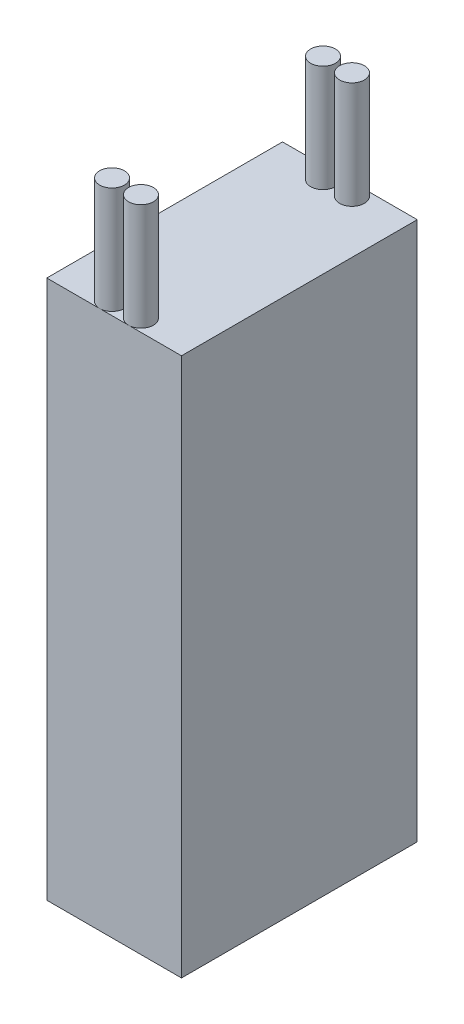
ISO-10303-21;
HEADER;
FILE_DESCRIPTION(('STEP AP214'),'2;1');
FILE_NAME('part.step','',(''),(''),'','','');
FILE_SCHEMA(('AUTOMOTIVE_DESIGN { 1 0 10303 214 1 1 1 1 }'));
ENDSEC;
DATA;
#1=APPLICATION_CONTEXT('core data for automotive mechanical design processes');
#2=APPLICATION_PROTOCOL_DEFINITION('international standard','automotive_design',2000,#1);
#3=PRODUCT_CONTEXT('',#1,'mechanical');
#4=PRODUCT('Part','Part','',(#3));
#5=PRODUCT_RELATED_PRODUCT_CATEGORY('part','',(#4));
#6=PRODUCT_DEFINITION_FORMATION('','',#4);
#7=PRODUCT_DEFINITION_CONTEXT('part definition',#1,'design');
#8=PRODUCT_DEFINITION('design','',#6,#7);
#9=PRODUCT_DEFINITION_SHAPE('','',#8);
#10=(LENGTH_UNIT() NAMED_UNIT(*) SI_UNIT(.MILLI.,.METRE.));
#11=(NAMED_UNIT(*) PLANE_ANGLE_UNIT() SI_UNIT($,.RADIAN.));
#12=(NAMED_UNIT(*) SI_UNIT($,.STERADIAN.) SOLID_ANGLE_UNIT());
#13=UNCERTAINTY_MEASURE_WITH_UNIT(LENGTH_MEASURE(1.E-05),#10,'distance_accuracy_value','');
#14=(GEOMETRIC_REPRESENTATION_CONTEXT(3) GLOBAL_UNCERTAINTY_ASSIGNED_CONTEXT((#13)) GLOBAL_UNIT_ASSIGNED_CONTEXT((#10,
#11,#12)) REPRESENTATION_CONTEXT('',''));
#15=CARTESIAN_POINT('',(0.,0.,0.));
#16=DIRECTION('',(0.,0.,1.));
#17=DIRECTION('',(1.,0.,0.));
#18=AXIS2_PLACEMENT_3D('',#15,#16,#17);
#19=CARTESIAN_POINT('',(0.,64.,0.));
#20=DIRECTION('',(1.,0.,0.));
#21=DIRECTION('',(0.,0.,-1.));
#22=AXIS2_PLACEMENT_3D('',#19,#20,#21);
#23=PLANE('',#22);
#24=DIRECTION('',(0.,0.,1.));
#25=VECTOR('',#24,1.);
#26=CARTESIAN_POINT('',(0.,0.,0.));
#27=LINE('',#26,#25);
#28=CARTESIAN_POINT('',(0.,0.,-28.));
#29=VERTEX_POINT('',#28);
#30=CARTESIAN_POINT('',(0.,0.,0.));
#31=VERTEX_POINT('',#30);
#32=EDGE_CURVE('E149',#29,#31,#27,.T.);
#33=ORIENTED_EDGE('',*,*,#32,.T.);
#34=DIRECTION('',(0.,-1.,0.));
#35=VECTOR('',#34,1.);
#36=CARTESIAN_POINT('',(0.,64.,0.));
#37=LINE('',#36,#35);
#38=CARTESIAN_POINT('',(0.,64.,0.));
#39=VERTEX_POINT('',#38);
#40=EDGE_CURVE('E11',#39,#31,#37,.T.);
#41=ORIENTED_EDGE('',*,*,#40,.F.);
#42=DIRECTION('',(0.,0.,1.));
#43=VECTOR('',#42,1.);
#44=CARTESIAN_POINT('',(0.,64.,0.));
#45=LINE('',#44,#43);
#46=CARTESIAN_POINT('',(0.,64.,-28.));
#47=VERTEX_POINT('',#46);
#48=EDGE_CURVE('E148',#47,#39,#45,.T.);
#49=ORIENTED_EDGE('',*,*,#48,.F.);
#50=DIRECTION('',(0.,-1.,0.));
#51=VECTOR('',#50,1.);
#52=CARTESIAN_POINT('',(0.,64.,-28.));
#53=LINE('',#52,#51);
#54=EDGE_CURVE('E119',#47,#29,#53,.T.);
#55=ORIENTED_EDGE('',*,*,#54,.T.);
#56=EDGE_LOOP('',(#33,#41,#49,#55));
#57=FACE_BOUND('',#56,.T.);
#58=ADVANCED_FACE('F45',(#57),#23,.F.);
#59=CARTESIAN_POINT('',(0.,64.,0.));
#60=DIRECTION('',(0.,0.,-1.));
#61=DIRECTION('',(-1.,0.,0.));
#62=AXIS2_PLACEMENT_3D('',#59,#60,#61);
#63=PLANE('',#62);
#64=DIRECTION('',(1.,0.,0.));
#65=VECTOR('',#64,1.);
#66=CARTESIAN_POINT('',(0.,0.,0.));
#67=LINE('',#66,#65);
#68=CARTESIAN_POINT('',(16.,0.,0.));
#69=VERTEX_POINT('',#68);
#70=EDGE_CURVE('E144',#31,#69,#67,.T.);
#71=ORIENTED_EDGE('',*,*,#70,.T.);
#72=DIRECTION('',(0.,-1.,0.));
#73=VECTOR('',#72,1.);
#74=CARTESIAN_POINT('',(16.,64.,0.));
#75=LINE('',#74,#73);
#76=CARTESIAN_POINT('',(16.,64.,0.));
#77=VERTEX_POINT('',#76);
#78=EDGE_CURVE('E54',#77,#69,#75,.T.);
#79=ORIENTED_EDGE('',*,*,#78,.F.);
#80=DIRECTION('',(1.,0.,0.));
#81=VECTOR('',#80,1.);
#82=CARTESIAN_POINT('',(0.,64.,0.));
#83=LINE('',#82,#81);
#84=CARTESIAN_POINT('',(9.719936624,64.,0.));
#85=VERTEX_POINT('',#84);
#86=EDGE_CURVE('E167',#85,#77,#83,.T.);
#87=ORIENTED_EDGE('',*,*,#86,.F.);
#88=CARTESIAN_POINT('',(6.280063122,64.,0.));
#89=VERTEX_POINT('',#88);
#90=EDGE_CURVE('E169',#89,#85,#83,.T.);
#91=ORIENTED_EDGE('',*,*,#90,.F.);
#92=EDGE_CURVE('E94',#39,#89,#83,.T.);
#93=ORIENTED_EDGE('',*,*,#92,.F.);
#94=ORIENTED_EDGE('',*,*,#40,.T.);
#95=EDGE_LOOP('',(#71,#79,#87,#91,#93,#94));
#96=FACE_BOUND('',#95,.T.);
#97=ADVANCED_FACE('F176',(#96),#63,.F.);
#98=CARTESIAN_POINT('',(16.,64.,0.));
#99=DIRECTION('',(-1.,0.,0.));
#100=DIRECTION('',(0.,0.,1.));
#101=AXIS2_PLACEMENT_3D('',#98,#99,#100);
#102=PLANE('',#101);
#103=DIRECTION('',(0.,0.,-1.));
#104=VECTOR('',#103,1.);
#105=CARTESIAN_POINT('',(16.,0.,0.));
#106=LINE('',#105,#104);
#107=CARTESIAN_POINT('',(16.,0.,-28.));
#108=VERTEX_POINT('',#107);
#109=EDGE_CURVE('E81',#69,#108,#106,.T.);
#110=ORIENTED_EDGE('',*,*,#109,.T.);
#111=DIRECTION('',(0.,-1.,0.));
#112=VECTOR('',#111,1.);
#113=CARTESIAN_POINT('',(16.,64.,-28.));
#114=LINE('',#113,#112);
#115=CARTESIAN_POINT('',(16.,64.,-28.));
#116=VERTEX_POINT('',#115);
#117=EDGE_CURVE('E128',#116,#108,#114,.T.);
#118=ORIENTED_EDGE('',*,*,#117,.F.);
#119=DIRECTION('',(0.,0.,-1.));
#120=VECTOR('',#119,1.);
#121=CARTESIAN_POINT('',(16.,64.,0.));
#122=LINE('',#121,#120);
#123=EDGE_CURVE('E122',#77,#116,#122,.T.);
#124=ORIENTED_EDGE('',*,*,#123,.F.);
#125=ORIENTED_EDGE('',*,*,#78,.T.);
#126=EDGE_LOOP('',(#110,#118,#124,#125));
#127=FACE_BOUND('',#126,.T.);
#128=ADVANCED_FACE('F140',(#127),#102,.F.);
#129=CARTESIAN_POINT('',(0.,64.,-28.));
#130=DIRECTION('',(0.,0.,1.));
#131=DIRECTION('',(1.,0.,0.));
#132=AXIS2_PLACEMENT_3D('',#129,#130,#131);
#133=PLANE('',#132);
#134=DIRECTION('',(-1.,0.,0.));
#135=VECTOR('',#134,1.);
#136=CARTESIAN_POINT('',(0.,0.,-28.));
#137=LINE('',#136,#135);
#138=EDGE_CURVE('E87',#108,#29,#137,.T.);
#139=ORIENTED_EDGE('',*,*,#138,.T.);
#140=ORIENTED_EDGE('',*,*,#54,.F.);
#141=DIRECTION('',(-1.,0.,0.));
#142=VECTOR('',#141,1.);
#143=CARTESIAN_POINT('',(0.,64.,-28.));
#144=LINE('',#143,#142);
#145=CARTESIAN_POINT('',(6.280063122,64.,-28.));
#146=VERTEX_POINT('',#145);
#147=EDGE_CURVE('E62',#146,#47,#144,.T.);
#148=ORIENTED_EDGE('',*,*,#147,.F.);
#149=CARTESIAN_POINT('',(9.719936624,64.,-28.));
#150=VERTEX_POINT('',#149);
#151=EDGE_CURVE('E108',#150,#146,#144,.T.);
#152=ORIENTED_EDGE('',*,*,#151,.F.);
#153=EDGE_CURVE('E116',#116,#150,#144,.T.);
#154=ORIENTED_EDGE('',*,*,#153,.F.);
#155=ORIENTED_EDGE('',*,*,#117,.T.);
#156=EDGE_LOOP('',(#139,#140,#148,#152,#154,#155));
#157=FACE_BOUND('',#156,.T.);
#158=ADVANCED_FACE('F118',(#157),#133,.F.);
#159=CARTESIAN_POINT('',(0.,64.,0.));
#160=DIRECTION('',(0.,-1.,0.));
#161=DIRECTION('',(0.,0.,-1.));
#162=AXIS2_PLACEMENT_3D('',#159,#160,#161);
#163=PLANE('',#162);
#164=ORIENTED_EDGE('',*,*,#153,.T.);
#165=CARTESIAN_POINT('',(9.719936624,64.,-26.5300632764173));
#166=DIRECTION('',(0.,1.,0.));
#167=DIRECTION('',(0.,0.,1.));
#168=AXIS2_PLACEMENT_3D('',#165,#166,#167);
#169=CIRCLE('',#168,1.4699367235827);
#170=EDGE_CURVE('E113',#150,#150,#169,.T.);
#171=ORIENTED_EDGE('',*,*,#170,.F.);
#172=ORIENTED_EDGE('',*,*,#151,.T.);
#173=CARTESIAN_POINT('',(6.280063122,64.,-26.5300632764173));
#174=DIRECTION('',(0.,1.,0.));
#175=DIRECTION('',(0.,0.,1.));
#176=AXIS2_PLACEMENT_3D('',#173,#174,#175);
#177=CIRCLE('',#176,1.4699367235827);
#178=EDGE_CURVE('E111',#146,#146,#177,.T.);
#179=ORIENTED_EDGE('',*,*,#178,.F.);
#180=ORIENTED_EDGE('',*,*,#147,.T.);
#181=ORIENTED_EDGE('',*,*,#48,.T.);
#182=ORIENTED_EDGE('',*,*,#92,.T.);
#183=CARTESIAN_POINT('',(6.280063122,64.,-1.4699367235827));
#184=DIRECTION('',(0.,1.,0.));
#185=DIRECTION('',(0.,0.,-1.));
#186=AXIS2_PLACEMENT_3D('',#183,#184,#185);
#187=CIRCLE('',#186,1.4699367235827);
#188=EDGE_CURVE('E178',#89,#89,#187,.T.);
#189=ORIENTED_EDGE('',*,*,#188,.F.);
#190=ORIENTED_EDGE('',*,*,#90,.T.);
#191=CARTESIAN_POINT('',(9.719936624,64.,-1.4699367235827));
#192=DIRECTION('',(0.,1.,0.));
#193=DIRECTION('',(0.,0.,-1.));
#194=AXIS2_PLACEMENT_3D('',#191,#192,#193);
#195=CIRCLE('',#194,1.4699367235827);
#196=EDGE_CURVE('E175',#85,#85,#195,.T.);
#197=ORIENTED_EDGE('',*,*,#196,.F.);
#198=ORIENTED_EDGE('',*,*,#86,.T.);
#199=ORIENTED_EDGE('',*,*,#123,.T.);
#200=EDGE_LOOP('',(#164,#171,#172,#179,#180,#181,#182,#189,#190,#197,#198,#199));
#201=FACE_BOUND('',#200,.T.);
#202=ADVANCED_FACE('F109',(#201),#163,.F.);
#203=CARTESIAN_POINT('',(0.,0.,0.));
#204=DIRECTION('',(0.,-1.,0.));
#205=DIRECTION('',(0.,0.,-1.));
#206=AXIS2_PLACEMENT_3D('',#203,#204,#205);
#207=PLANE('',#206);
#208=ORIENTED_EDGE('',*,*,#32,.F.);
#209=ORIENTED_EDGE('',*,*,#138,.F.);
#210=ORIENTED_EDGE('',*,*,#109,.F.);
#211=ORIENTED_EDGE('',*,*,#70,.F.);
#212=EDGE_LOOP('',(#208,#209,#210,#211));
#213=FACE_BOUND('',#212,.T.);
#214=ADVANCED_FACE('F143',(#213),#207,.T.);
#215=CARTESIAN_POINT('',(6.280063122,76.7,-26.5300632764173));
#216=DIRECTION('',(0.,-1.,0.));
#217=DIRECTION('',(0.,0.,-1.));
#218=AXIS2_PLACEMENT_3D('',#215,#216,#217);
#219=CYLINDRICAL_SURFACE('',#218,1.4699367235827);
#220=CARTESIAN_POINT('',(6.280063122,76.7,-26.5300632764173));
#221=DIRECTION('',(0.,1.,0.));
#222=DIRECTION('',(0.,0.,1.));
#223=AXIS2_PLACEMENT_3D('',#220,#221,#222);
#224=CIRCLE('',#223,1.4699367235827);
#225=CARTESIAN_POINT('',(6.280063122,76.7,-25.0601265528346));
#226=VERTEX_POINT('',#225);
#227=EDGE_CURVE('E152',#226,#226,#224,.T.);
#228=ORIENTED_EDGE('',*,*,#227,.F.);
#229=EDGE_LOOP('',(#228));
#230=FACE_BOUND('',#229,.T.);
#231=ORIENTED_EDGE('',*,*,#178,.T.);
#232=EDGE_LOOP('',(#231));
#233=FACE_BOUND('',#232,.T.);
#234=ADVANCED_FACE('F209',(#230,#233),#219,.T.);
#235=CARTESIAN_POINT('',(6.280063122,76.7,-26.5300632764173));
#236=DIRECTION('',(0.,1.,0.));
#237=DIRECTION('',(0.,0.,1.));
#238=AXIS2_PLACEMENT_3D('',#235,#236,#237);
#239=PLANE('',#238);
#240=ORIENTED_EDGE('',*,*,#227,.T.);
#241=EDGE_LOOP('',(#240));
#242=FACE_BOUND('',#241,.T.);
#243=ADVANCED_FACE('F199',(#242),#239,.T.);
#244=CARTESIAN_POINT('',(9.719936624,76.7,-1.4699367235827));
#245=DIRECTION('',(0.,-1.,0.));
#246=DIRECTION('',(0.,0.,-1.));
#247=AXIS2_PLACEMENT_3D('',#244,#245,#246);
#248=CYLINDRICAL_SURFACE('',#247,1.4699367235827);
#249=CARTESIAN_POINT('',(9.719936624,76.7,-1.4699367235827));
#250=DIRECTION('',(0.,1.,0.));
#251=DIRECTION('',(0.,0.,-1.));
#252=AXIS2_PLACEMENT_3D('',#249,#250,#251);
#253=CIRCLE('',#252,1.4699367235827);
#254=CARTESIAN_POINT('',(9.719936624,76.7,-2.9398734471654));
#255=VERTEX_POINT('',#254);
#256=EDGE_CURVE('E190',#255,#255,#253,.T.);
#257=ORIENTED_EDGE('',*,*,#256,.F.);
#258=EDGE_LOOP('',(#257));
#259=FACE_BOUND('',#258,.T.);
#260=ORIENTED_EDGE('',*,*,#196,.T.);
#261=EDGE_LOOP('',(#260));
#262=FACE_BOUND('',#261,.T.);
#263=ADVANCED_FACE('F196',(#259,#262),#248,.T.);
#264=CARTESIAN_POINT('',(9.719936624,76.7,-1.4699367235827));
#265=DIRECTION('',(0.,-1.,0.));
#266=DIRECTION('',(0.,0.,-1.));
#267=AXIS2_PLACEMENT_3D('',#264,#265,#266);
#268=PLANE('',#267);
#269=ORIENTED_EDGE('',*,*,#256,.T.);
#270=EDGE_LOOP('',(#269));
#271=FACE_BOUND('',#270,.T.);
#272=ADVANCED_FACE('F198',(#271),#268,.F.);
#273=CARTESIAN_POINT('',(6.280063122,76.7,-1.4699367235827));
#274=DIRECTION('',(0.,-1.,0.));
#275=DIRECTION('',(0.,0.,-1.));
#276=AXIS2_PLACEMENT_3D('',#273,#274,#275);
#277=CYLINDRICAL_SURFACE('',#276,1.4699367235827);
#278=CARTESIAN_POINT('',(6.280063122,76.7,-1.4699367235827));
#279=DIRECTION('',(0.,1.,0.));
#280=DIRECTION('',(0.,0.,-1.));
#281=AXIS2_PLACEMENT_3D('',#278,#279,#280);
#282=CIRCLE('',#281,1.4699367235827);
#283=CARTESIAN_POINT('',(6.280063122,76.7,-2.9398734471654));
#284=VERTEX_POINT('',#283);
#285=EDGE_CURVE('E162',#284,#284,#282,.T.);
#286=ORIENTED_EDGE('',*,*,#285,.F.);
#287=EDGE_LOOP('',(#286));
#288=FACE_BOUND('',#287,.T.);
#289=ORIENTED_EDGE('',*,*,#188,.T.);
#290=EDGE_LOOP('',(#289));
#291=FACE_BOUND('',#290,.T.);
#292=ADVANCED_FACE('F206',(#288,#291),#277,.T.);
#293=CARTESIAN_POINT('',(6.280063122,76.7,-1.4699367235827));
#294=DIRECTION('',(0.,-1.,0.));
#295=DIRECTION('',(0.,0.,-1.));
#296=AXIS2_PLACEMENT_3D('',#293,#294,#295);
#297=PLANE('',#296);
#298=ORIENTED_EDGE('',*,*,#285,.T.);
#299=EDGE_LOOP('',(#298));
#300=FACE_BOUND('',#299,.T.);
#301=ADVANCED_FACE('F230',(#300),#297,.F.);
#302=CARTESIAN_POINT('',(9.719936624,76.7,-26.5300632764173));
#303=DIRECTION('',(0.,-1.,0.));
#304=DIRECTION('',(0.,0.,-1.));
#305=AXIS2_PLACEMENT_3D('',#302,#303,#304);
#306=CYLINDRICAL_SURFACE('',#305,1.4699367235827);
#307=CARTESIAN_POINT('',(9.719936624,76.7,-26.5300632764173));
#308=DIRECTION('',(0.,1.,0.));
#309=DIRECTION('',(0.,0.,1.));
#310=AXIS2_PLACEMENT_3D('',#307,#308,#309);
#311=CIRCLE('',#310,1.4699367235827);
#312=CARTESIAN_POINT('',(9.719936624,76.7,-25.0601265528346));
#313=VERTEX_POINT('',#312);
#314=EDGE_CURVE('E181',#313,#313,#311,.T.);
#315=ORIENTED_EDGE('',*,*,#314,.F.);
#316=EDGE_LOOP('',(#315));
#317=FACE_BOUND('',#316,.T.);
#318=ORIENTED_EDGE('',*,*,#170,.T.);
#319=EDGE_LOOP('',(#318));
#320=FACE_BOUND('',#319,.T.);
#321=ADVANCED_FACE('F233',(#317,#320),#306,.T.);
#322=CARTESIAN_POINT('',(9.719936624,76.7,-26.5300632764173));
#323=DIRECTION('',(0.,1.,0.));
#324=DIRECTION('',(0.,0.,1.));
#325=AXIS2_PLACEMENT_3D('',#322,#323,#324);
#326=PLANE('',#325);
#327=ORIENTED_EDGE('',*,*,#314,.T.);
#328=EDGE_LOOP('',(#327));
#329=FACE_BOUND('',#328,.T.);
#330=ADVANCED_FACE('F238',(#329),#326,.T.);
#331=CLOSED_SHELL('',(#58,#97,#128,#158,#202,#214,#234,#243,#263,#272,#292,#301,#321,#330));
#332=MANIFOLD_SOLID_BREP('B2',#331);
#333=ADVANCED_BREP_SHAPE_REPRESENTATION('',(#18,#332),#14);
#334=SHAPE_DEFINITION_REPRESENTATION(#9,#333);
ENDSEC;
END-ISO-10303-21;
